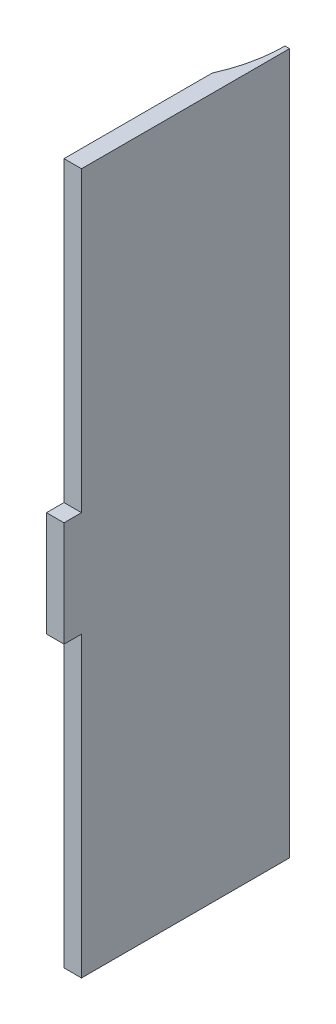
ISO-10303-21;
HEADER;
FILE_DESCRIPTION(('STEP AP214'),'2;1');
FILE_NAME('part.step','',(''),(''),'','','');
FILE_SCHEMA(('AUTOMOTIVE_DESIGN { 1 0 10303 214 1 1 1 1 }'));
ENDSEC;
DATA;
#1=APPLICATION_CONTEXT('core data for automotive mechanical design processes');
#2=APPLICATION_PROTOCOL_DEFINITION('international standard','automotive_design',2000,#1);
#3=PRODUCT_CONTEXT('',#1,'mechanical');
#4=PRODUCT('Part','Part','',(#3));
#5=PRODUCT_RELATED_PRODUCT_CATEGORY('part','',(#4));
#6=PRODUCT_DEFINITION_FORMATION('','',#4);
#7=PRODUCT_DEFINITION_CONTEXT('part definition',#1,'design');
#8=PRODUCT_DEFINITION('design','',#6,#7);
#9=PRODUCT_DEFINITION_SHAPE('','',#8);
#10=(LENGTH_UNIT() NAMED_UNIT(*) SI_UNIT(.MILLI.,.METRE.));
#11=(NAMED_UNIT(*) PLANE_ANGLE_UNIT() SI_UNIT($,.RADIAN.));
#12=(NAMED_UNIT(*) SI_UNIT($,.STERADIAN.) SOLID_ANGLE_UNIT());
#13=UNCERTAINTY_MEASURE_WITH_UNIT(LENGTH_MEASURE(1.E-05),#10,'distance_accuracy_value','');
#14=(GEOMETRIC_REPRESENTATION_CONTEXT(3) GLOBAL_UNCERTAINTY_ASSIGNED_CONTEXT((#13)) GLOBAL_UNIT_ASSIGNED_CONTEXT((#10,
#11,#12)) REPRESENTATION_CONTEXT('',''));
#15=CARTESIAN_POINT('',(0.,0.,0.));
#16=DIRECTION('',(0.,0.,1.));
#17=DIRECTION('',(1.,0.,0.));
#18=AXIS2_PLACEMENT_3D('',#15,#16,#17);
#19=CARTESIAN_POINT('',(0.,0.,0.));
#20=DIRECTION('',(-1.,0.,0.));
#21=DIRECTION('',(0.,0.,-1.));
#22=AXIS2_PLACEMENT_3D('',#19,#20,#21);
#23=PLANE('',#22);
#24=DIRECTION('',(0.,0.,1.));
#25=VECTOR('',#24,1.);
#26=CARTESIAN_POINT('',(0.,-31.75,-12.7));
#27=LINE('',#26,#25);
#28=CARTESIAN_POINT('',(0.,-31.75,-0.732018985622581));
#29=VERTEX_POINT('',#28);
#30=CARTESIAN_POINT('',(0.,-31.75,12.7));
#31=VERTEX_POINT('',#30);
#32=EDGE_CURVE('E179',#29,#31,#27,.T.);
#33=ORIENTED_EDGE('',*,*,#32,.T.);
#34=DIRECTION('',(0.,1.,0.));
#35=VECTOR('',#34,1.);
#36=CARTESIAN_POINT('',(0.,-31.75,12.7));
#37=LINE('',#36,#35);
#38=CARTESIAN_POINT('',(0.,-4.7625,12.7));
#39=VERTEX_POINT('',#38);
#40=EDGE_CURVE('E174',#31,#39,#37,.T.);
#41=ORIENTED_EDGE('',*,*,#40,.T.);
#42=DIRECTION('',(0.,0.,1.));
#43=VECTOR('',#42,1.);
#44=CARTESIAN_POINT('',(0.,-4.7625,12.7));
#45=LINE('',#44,#43);
#46=CARTESIAN_POINT('',(0.,-4.7625,14.2875));
#47=VERTEX_POINT('',#46);
#48=EDGE_CURVE('E144',#39,#47,#45,.T.);
#49=ORIENTED_EDGE('',*,*,#48,.T.);
#50=DIRECTION('',(0.,-1.,0.));
#51=VECTOR('',#50,1.);
#52=CARTESIAN_POINT('',(0.,4.7625,14.2875));
#53=LINE('',#52,#51);
#54=CARTESIAN_POINT('',(0.,4.7625,14.2875));
#55=VERTEX_POINT('',#54);
#56=EDGE_CURVE('E147',#55,#47,#53,.T.);
#57=ORIENTED_EDGE('',*,*,#56,.F.);
#58=DIRECTION('',(0.,0.,1.));
#59=VECTOR('',#58,1.);
#60=CARTESIAN_POINT('',(0.,4.7625,12.7));
#61=LINE('',#60,#59);
#62=CARTESIAN_POINT('',(0.,4.7625,12.7));
#63=VERTEX_POINT('',#62);
#64=EDGE_CURVE('E151',#63,#55,#61,.T.);
#65=ORIENTED_EDGE('',*,*,#64,.F.);
#66=CARTESIAN_POINT('',(0.,31.75,12.7));
#67=VERTEX_POINT('',#66);
#68=EDGE_CURVE('E160',#63,#67,#37,.T.);
#69=ORIENTED_EDGE('',*,*,#68,.T.);
#70=DIRECTION('',(0.,0.,-1.));
#71=VECTOR('',#70,1.);
#72=CARTESIAN_POINT('',(0.,31.75,-12.7));
#73=LINE('',#72,#71);
#74=CARTESIAN_POINT('',(0.,31.75,-0.73083681445771));
#75=VERTEX_POINT('',#74);
#76=EDGE_CURVE('E177',#67,#75,#73,.T.);
#77=ORIENTED_EDGE('',*,*,#76,.T.);
#78=CARTESIAN_POINT('',(0.,-96.5932028494407,-0.733226484432536));
#79=CARTESIAN_POINT('',(0.,-87.8725361842865,-0.733064067850358));
#80=CARTESIAN_POINT('',(0.,-79.1518695191321,-0.732901660085491));
#81=CARTESIAN_POINT('',(0.,-35.5485361933594,-0.732089665335835));
#82=CARTESIAN_POINT('',(0.,-0.665869532738547,-0.731440210575085));
#83=CARTESIAN_POINT('',(0.,55.0089323684026,-0.730403867177126));
#84=CARTESIAN_POINT('',(0.,75.8010676089212,-0.73001688770823));
#85=CARTESIAN_POINT('',(0.,96.5932028494407,-0.72962995826237));
#86=B_SPLINE_CURVE_WITH_KNOTS('',3,(#78,#79,#80,#81,#82,#83,#84,#85),.UNSPECIFIED.,.F.,.F.,(4,2,
2,4),(0.,26.162,130.81,193.186405732359),.UNSPECIFIED.);
#87=EDGE_CURVE('E119',#29,#75,#86,.T.);
#88=ORIENTED_EDGE('',*,*,#87,.F.);
#89=EDGE_LOOP('',(#33,#41,#49,#57,#65,#69,#77,#88));
#90=FACE_BOUND('',#89,.T.);
#91=ADVANCED_FACE('F43',(#90),#23,.T.);
#92=CARTESIAN_POINT('',(0.,31.75,-6.14934));
#93=DIRECTION('',(0.,0.,-1.));
#94=DIRECTION('',(0.,-1.,0.));
#95=AXIS2_PLACEMENT_3D('',#92,#93,#94);
#96=PLANE('',#95);
#97=DIRECTION('',(1.,0.,0.));
#98=VECTOR('',#97,1.);
#99=CARTESIAN_POINT('',(0.,31.75,-6.14934));
#100=LINE('',#99,#98);
#101=CARTESIAN_POINT('',(1.17501897251106,31.75,-6.14934000000179));
#102=VERTEX_POINT('',#101);
#103=CARTESIAN_POINT('',(1.5875,31.75,-6.14934));
#104=VERTEX_POINT('',#103);
#105=EDGE_CURVE('E129',#102,#104,#100,.T.);
#106=ORIENTED_EDGE('',*,*,#105,.T.);
#107=DIRECTION('',(0.,-1.,0.));
#108=VECTOR('',#107,1.);
#109=CARTESIAN_POINT('',(1.5875,31.75,-6.14934));
#110=LINE('',#109,#108);
#111=CARTESIAN_POINT('',(1.5875,-31.75,-6.14933999999999));
#112=VERTEX_POINT('',#111);
#113=EDGE_CURVE('E139',#104,#112,#110,.T.);
#114=ORIENTED_EDGE('',*,*,#113,.T.);
#115=DIRECTION('',(1.,0.,0.));
#116=VECTOR('',#115,1.);
#117=CARTESIAN_POINT('',(0.,-31.75,-6.14933999999999));
#118=LINE('',#117,#116);
#119=CARTESIAN_POINT('',(1.17448102819902,-31.75,-6.14934000000119));
#120=VERTEX_POINT('',#119);
#121=EDGE_CURVE('E130',#120,#112,#118,.T.);
#122=ORIENTED_EDGE('',*,*,#121,.F.);
#123=DIRECTION('',(8.47156396888149E-06,0.999999999964116,0.));
#124=VECTOR('',#123,1.);
#125=CARTESIAN_POINT('',(1.17339607735071,-159.819722693512,-6.14933999999998));
#126=LINE('',#125,#124);
#127=EDGE_CURVE('E11',#102,#120,#126,.F.);
#128=ORIENTED_EDGE('',*,*,#127,.F.);
#129=EDGE_LOOP('',(#106,#114,#122,#128));
#130=FACE_BOUND('',#129,.T.);
#131=ADVANCED_FACE('F127',(#130),#96,.T.);
#132=CARTESIAN_POINT('',(1.5875,0.,0.));
#133=DIRECTION('',(-1.,0.,0.));
#134=DIRECTION('',(0.,0.,-1.));
#135=AXIS2_PLACEMENT_3D('',#132,#133,#134);
#136=PLANE('',#135);
#137=ORIENTED_EDGE('',*,*,#113,.F.);
#138=DIRECTION('',(0.,0.,-1.));
#139=VECTOR('',#138,1.);
#140=CARTESIAN_POINT('',(1.5875,31.75,-12.7));
#141=LINE('',#140,#139);
#142=CARTESIAN_POINT('',(1.5875,31.75,12.7));
#143=VERTEX_POINT('',#142);
#144=EDGE_CURVE('E133',#143,#104,#141,.T.);
#145=ORIENTED_EDGE('',*,*,#144,.F.);
#146=DIRECTION('',(0.,1.,0.));
#147=VECTOR('',#146,1.);
#148=CARTESIAN_POINT('',(1.5875,-31.75,12.7));
#149=LINE('',#148,#147);
#150=CARTESIAN_POINT('',(1.5875,4.7625,12.7));
#151=VERTEX_POINT('',#150);
#152=EDGE_CURVE('E168',#151,#143,#149,.T.);
#153=ORIENTED_EDGE('',*,*,#152,.F.);
#154=DIRECTION('',(0.,0.,1.));
#155=VECTOR('',#154,1.);
#156=CARTESIAN_POINT('',(1.5875,4.7625,12.7));
#157=LINE('',#156,#155);
#158=CARTESIAN_POINT('',(1.5875,4.7625,14.2875));
#159=VERTEX_POINT('',#158);
#160=EDGE_CURVE('E148',#151,#159,#157,.T.);
#161=ORIENTED_EDGE('',*,*,#160,.T.);
#162=DIRECTION('',(0.,-1.,0.));
#163=VECTOR('',#162,1.);
#164=CARTESIAN_POINT('',(1.5875,4.7625,14.2875));
#165=LINE('',#164,#163);
#166=CARTESIAN_POINT('',(1.5875,-4.7625,14.2875));
#167=VERTEX_POINT('',#166);
#168=EDGE_CURVE('E137',#159,#167,#165,.T.);
#169=ORIENTED_EDGE('',*,*,#168,.T.);
#170=DIRECTION('',(0.,0.,1.));
#171=VECTOR('',#170,1.);
#172=CARTESIAN_POINT('',(1.5875,-4.7625,12.7));
#173=LINE('',#172,#171);
#174=CARTESIAN_POINT('',(1.5875,-4.7625,12.7));
#175=VERTEX_POINT('',#174);
#176=EDGE_CURVE('E135',#175,#167,#173,.T.);
#177=ORIENTED_EDGE('',*,*,#176,.F.);
#178=CARTESIAN_POINT('',(1.5875,-31.75,12.7));
#179=VERTEX_POINT('',#178);
#180=EDGE_CURVE('E166',#179,#175,#149,.T.);
#181=ORIENTED_EDGE('',*,*,#180,.F.);
#182=DIRECTION('',(0.,0.,1.));
#183=VECTOR('',#182,1.);
#184=CARTESIAN_POINT('',(1.5875,-31.75,-12.7));
#185=LINE('',#184,#183);
#186=EDGE_CURVE('E170',#112,#179,#185,.T.);
#187=ORIENTED_EDGE('',*,*,#186,.F.);
#188=EDGE_LOOP('',(#137,#145,#153,#161,#169,#177,#181,#187));
#189=FACE_BOUND('',#188,.T.);
#190=ADVANCED_FACE('F196',(#189),#136,.F.);
#191=CARTESIAN_POINT('',(1.5875,31.75,-12.7));
#192=DIRECTION('',(0.,-1.,0.));
#193=DIRECTION('',(0.,0.,1.));
#194=AXIS2_PLACEMENT_3D('',#191,#192,#193);
#195=PLANE('',#194);
#196=CARTESIAN_POINT('',(-11.9059810279583,31.75,-6.14934000003114));
#197=DIRECTION('',(0.,1.,0.));
#198=DIRECTION('',(1.,0.,-2.22076517591911E-09));
#199=AXIS2_PLACEMENT_3D('',#196,#197,#198);
#200=ELLIPSE('',#199,13.0810000004694,13.081);
#201=EDGE_CURVE('E114',#102,#75,#200,.F.);
#202=ORIENTED_EDGE('',*,*,#201,.T.);
#203=ORIENTED_EDGE('',*,*,#76,.F.);
#204=DIRECTION('',(-1.,0.,0.));
#205=VECTOR('',#204,1.);
#206=CARTESIAN_POINT('',(1.5875,31.75,12.7));
#207=LINE('',#206,#205);
#208=EDGE_CURVE('E51',#143,#67,#207,.T.);
#209=ORIENTED_EDGE('',*,*,#208,.F.);
#210=ORIENTED_EDGE('',*,*,#144,.T.);
#211=ORIENTED_EDGE('',*,*,#105,.F.);
#212=EDGE_LOOP('',(#202,#203,#209,#210,#211));
#213=FACE_BOUND('',#212,.T.);
#214=ADVANCED_FACE('F131',(#213),#195,.F.);
#215=CARTESIAN_POINT('',(1.5875,-31.75,-12.7));
#216=DIRECTION('',(0.,1.,0.));
#217=DIRECTION('',(0.,0.,-1.));
#218=AXIS2_PLACEMENT_3D('',#215,#216,#217);
#219=PLANE('',#218);
#220=CARTESIAN_POINT('',(-11.9065189722704,-31.75,-6.14934000002995));
#221=DIRECTION('',(0.,-1.,0.));
#222=DIRECTION('',(1.,0.,-2.22076517591911E-09));
#223=AXIS2_PLACEMENT_3D('',#220,#221,#222);
#224=ELLIPSE('',#223,13.0810000004694,13.081);
#225=EDGE_CURVE('E58',#29,#120,#224,.F.);
#226=ORIENTED_EDGE('',*,*,#225,.T.);
#227=ORIENTED_EDGE('',*,*,#121,.T.);
#228=ORIENTED_EDGE('',*,*,#186,.T.);
#229=DIRECTION('',(-1.,0.,0.));
#230=VECTOR('',#229,1.);
#231=CARTESIAN_POINT('',(1.5875,-31.75,12.7));
#232=LINE('',#231,#230);
#233=EDGE_CURVE('E173',#179,#31,#232,.T.);
#234=ORIENTED_EDGE('',*,*,#233,.T.);
#235=ORIENTED_EDGE('',*,*,#32,.F.);
#236=EDGE_LOOP('',(#226,#227,#228,#234,#235));
#237=FACE_BOUND('',#236,.T.);
#238=ADVANCED_FACE('F212',(#237),#219,.F.);
#239=CARTESIAN_POINT('',(1.5875,-31.75,12.7));
#240=DIRECTION('',(0.,0.,-1.));
#241=DIRECTION('',(1.,0.,0.));
#242=AXIS2_PLACEMENT_3D('',#239,#240,#241);
#243=PLANE('',#242);
#244=DIRECTION('',(1.,0.,0.));
#245=VECTOR('',#244,1.);
#246=CARTESIAN_POINT('',(0.,4.7625,12.7));
#247=LINE('',#246,#245);
#248=EDGE_CURVE('E161',#63,#151,#247,.T.);
#249=ORIENTED_EDGE('',*,*,#248,.T.);
#250=ORIENTED_EDGE('',*,*,#152,.T.);
#251=ORIENTED_EDGE('',*,*,#208,.T.);
#252=ORIENTED_EDGE('',*,*,#68,.F.);
#253=EDGE_LOOP('',(#249,#250,#251,#252));
#254=FACE_BOUND('',#253,.T.);
#255=ADVANCED_FACE('F185',(#254),#243,.F.);
#256=ORIENTED_EDGE('',*,*,#40,.F.);
#257=ORIENTED_EDGE('',*,*,#233,.F.);
#258=ORIENTED_EDGE('',*,*,#180,.T.);
#259=DIRECTION('',(1.,0.,0.));
#260=VECTOR('',#259,1.);
#261=CARTESIAN_POINT('',(0.,-4.7625,12.7));
#262=LINE('',#261,#260);
#263=EDGE_CURVE('E65',#39,#175,#262,.T.);
#264=ORIENTED_EDGE('',*,*,#263,.F.);
#265=EDGE_LOOP('',(#256,#257,#258,#264));
#266=FACE_BOUND('',#265,.T.);
#267=ADVANCED_FACE('F45',(#266),#243,.F.);
#268=CARTESIAN_POINT('',(0.,-4.7625,12.7));
#269=DIRECTION('',(0.,-1.,0.));
#270=DIRECTION('',(0.,0.,1.));
#271=AXIS2_PLACEMENT_3D('',#268,#269,#270);
#272=PLANE('',#271);
#273=ORIENTED_EDGE('',*,*,#176,.T.);
#274=DIRECTION('',(1.,0.,0.));
#275=VECTOR('',#274,1.);
#276=CARTESIAN_POINT('',(0.,-4.7625,14.2875));
#277=LINE('',#276,#275);
#278=EDGE_CURVE('E153',#47,#167,#277,.T.);
#279=ORIENTED_EDGE('',*,*,#278,.F.);
#280=ORIENTED_EDGE('',*,*,#48,.F.);
#281=ORIENTED_EDGE('',*,*,#263,.T.);
#282=EDGE_LOOP('',(#273,#279,#280,#281));
#283=FACE_BOUND('',#282,.T.);
#284=ADVANCED_FACE('F227',(#283),#272,.T.);
#285=CARTESIAN_POINT('',(0.,4.7625,12.7));
#286=DIRECTION('',(0.,-1.,0.));
#287=DIRECTION('',(0.,0.,1.));
#288=AXIS2_PLACEMENT_3D('',#285,#286,#287);
#289=PLANE('',#288);
#290=ORIENTED_EDGE('',*,*,#160,.F.);
#291=ORIENTED_EDGE('',*,*,#248,.F.);
#292=ORIENTED_EDGE('',*,*,#64,.T.);
#293=DIRECTION('',(1.,0.,0.));
#294=VECTOR('',#293,1.);
#295=CARTESIAN_POINT('',(0.,4.7625,14.2875));
#296=LINE('',#295,#294);
#297=EDGE_CURVE('E163',#55,#159,#296,.T.);
#298=ORIENTED_EDGE('',*,*,#297,.T.);
#299=EDGE_LOOP('',(#290,#291,#292,#298));
#300=FACE_BOUND('',#299,.T.);
#301=ADVANCED_FACE('F193',(#300),#289,.F.);
#302=CARTESIAN_POINT('',(0.,4.7625,14.2875));
#303=DIRECTION('',(0.,0.,-1.));
#304=DIRECTION('',(1.,0.,0.));
#305=AXIS2_PLACEMENT_3D('',#302,#303,#304);
#306=PLANE('',#305);
#307=ORIENTED_EDGE('',*,*,#168,.F.);
#308=ORIENTED_EDGE('',*,*,#297,.F.);
#309=ORIENTED_EDGE('',*,*,#56,.T.);
#310=ORIENTED_EDGE('',*,*,#278,.T.);
#311=EDGE_LOOP('',(#307,#308,#309,#310));
#312=FACE_BOUND('',#311,.T.);
#313=ADVANCED_FACE('F226',(#312),#306,.F.);
#314=CARTESIAN_POINT('',(-11.9076039221799,-159.819611876984,-6.14934000002754));
#315=DIRECTION('',(8.47156396888149E-06,0.999999999964116,0.));
#316=DIRECTION('',(-0.999999999964116,8.47156396888149E-06,-1.52359454198517E-13));
#317=AXIS2_PLACEMENT_3D('',#314,#315,#316);
#318=CYLINDRICAL_SURFACE('',#317,13.081);
#319=ORIENTED_EDGE('',*,*,#225,.F.);
#320=ORIENTED_EDGE('',*,*,#87,.T.);
#321=ORIENTED_EDGE('',*,*,#201,.F.);
#322=ORIENTED_EDGE('',*,*,#127,.T.);
#323=EDGE_LOOP('',(#319,#320,#321,#322));
#324=FACE_BOUND('',#323,.T.);
#325=ADVANCED_FACE('F116',(#324),#318,.F.);
#326=CLOSED_SHELL('',(#91,#131,#190,#214,#238,#255,#267,#284,#301,#313,#325));
#327=MANIFOLD_SOLID_BREP('B2',#326);
#328=ADVANCED_BREP_SHAPE_REPRESENTATION('',(#18,#327),#14);
#329=SHAPE_DEFINITION_REPRESENTATION(#9,#328);
ENDSEC;
END-ISO-10303-21;
